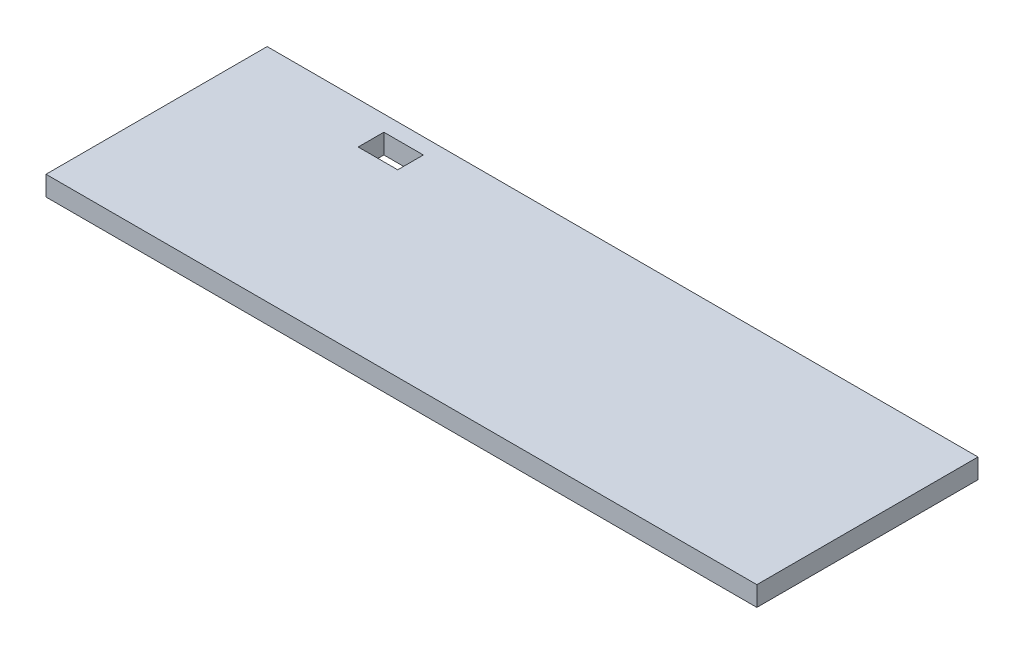
ISO-10303-21;
HEADER;
FILE_DESCRIPTION(('STEP AP214'),'2;1');
FILE_NAME('part.step','',(''),(''),'','','');
FILE_SCHEMA(('AUTOMOTIVE_DESIGN { 1 0 10303 214 1 1 1 1 }'));
ENDSEC;
DATA;
#1=APPLICATION_CONTEXT('core data for automotive mechanical design processes');
#2=APPLICATION_PROTOCOL_DEFINITION('international standard','automotive_design',2000,#1);
#3=PRODUCT_CONTEXT('',#1,'mechanical');
#4=PRODUCT('Part','Part','',(#3));
#5=PRODUCT_RELATED_PRODUCT_CATEGORY('part','',(#4));
#6=PRODUCT_DEFINITION_FORMATION('','',#4);
#7=PRODUCT_DEFINITION_CONTEXT('part definition',#1,'design');
#8=PRODUCT_DEFINITION('design','',#6,#7);
#9=PRODUCT_DEFINITION_SHAPE('','',#8);
#10=(LENGTH_UNIT() NAMED_UNIT(*) SI_UNIT(.MILLI.,.METRE.));
#11=(NAMED_UNIT(*) PLANE_ANGLE_UNIT() SI_UNIT($,.RADIAN.));
#12=(NAMED_UNIT(*) SI_UNIT($,.STERADIAN.) SOLID_ANGLE_UNIT());
#13=UNCERTAINTY_MEASURE_WITH_UNIT(LENGTH_MEASURE(1.E-05),#10,'distance_accuracy_value','');
#14=(GEOMETRIC_REPRESENTATION_CONTEXT(3) GLOBAL_UNCERTAINTY_ASSIGNED_CONTEXT((#13)) GLOBAL_UNIT_ASSIGNED_CONTEXT((#10,
#11,#12)) REPRESENTATION_CONTEXT('',''));
#15=CARTESIAN_POINT('',(0.,0.,0.));
#16=DIRECTION('',(0.,0.,1.));
#17=DIRECTION('',(1.,0.,0.));
#18=AXIS2_PLACEMENT_3D('',#15,#16,#17);
#19=CARTESIAN_POINT('',(0.,5.,0.));
#20=DIRECTION('',(0.,-1.,0.));
#21=DIRECTION('',(0.,0.,-1.));
#22=AXIS2_PLACEMENT_3D('',#19,#20,#21);
#23=PLANE('',#22);
#24=DIRECTION('',(0.,0.,-1.));
#25=VECTOR('',#24,1.);
#26=CARTESIAN_POINT('',(90.,5.,28.));
#27=LINE('',#26,#25);
#28=CARTESIAN_POINT('',(90.,5.,28.));
#29=VERTEX_POINT('',#28);
#30=CARTESIAN_POINT('',(90.,5.,-28.));
#31=VERTEX_POINT('',#30);
#32=EDGE_CURVE('E134',#29,#31,#27,.T.);
#33=ORIENTED_EDGE('',*,*,#32,.T.);
#34=DIRECTION('',(-1.,0.,0.));
#35=VECTOR('',#34,1.);
#36=CARTESIAN_POINT('',(-90.,5.,-28.));
#37=LINE('',#36,#35);
#38=CARTESIAN_POINT('',(-90.,5.,-28.));
#39=VERTEX_POINT('',#38);
#40=EDGE_CURVE('E137',#31,#39,#37,.T.);
#41=ORIENTED_EDGE('',*,*,#40,.T.);
#42=DIRECTION('',(0.,0.,1.));
#43=VECTOR('',#42,1.);
#44=CARTESIAN_POINT('',(-90.,5.,28.));
#45=LINE('',#44,#43);
#46=CARTESIAN_POINT('',(-90.,5.,28.));
#47=VERTEX_POINT('',#46);
#48=EDGE_CURVE('E140',#39,#47,#45,.T.);
#49=ORIENTED_EDGE('',*,*,#48,.T.);
#50=DIRECTION('',(1.,0.,0.));
#51=VECTOR('',#50,1.);
#52=CARTESIAN_POINT('',(-90.,5.,28.));
#53=LINE('',#52,#51);
#54=EDGE_CURVE('E142',#47,#29,#53,.T.);
#55=ORIENTED_EDGE('',*,*,#54,.T.);
#56=EDGE_LOOP('',(#33,#41,#49,#55));
#57=FACE_BOUND('',#56,.T.);
#58=DIRECTION('',(0.,0.,-1.));
#59=VECTOR('',#58,1.);
#60=CARTESIAN_POINT('',(-46.4434336198386,5.,-24.));
#61=LINE('',#60,#59);
#62=CARTESIAN_POINT('',(-46.4434336198386,5.,-17.5));
#63=VERTEX_POINT('',#62);
#64=CARTESIAN_POINT('',(-46.4434336198386,5.,-24.));
#65=VERTEX_POINT('',#64);
#66=EDGE_CURVE('E98',#63,#65,#61,.T.);
#67=ORIENTED_EDGE('',*,*,#66,.F.);
#68=DIRECTION('',(1.,0.,0.));
#69=VECTOR('',#68,1.);
#70=CARTESIAN_POINT('',(-56.4434336198386,5.,-17.5));
#71=LINE('',#70,#69);
#72=CARTESIAN_POINT('',(-56.4434336198386,5.,-17.5));
#73=VERTEX_POINT('',#72);
#74=EDGE_CURVE('E120',#73,#63,#71,.T.);
#75=ORIENTED_EDGE('',*,*,#74,.F.);
#76=DIRECTION('',(0.,0.,1.));
#77=VECTOR('',#76,1.);
#78=CARTESIAN_POINT('',(-56.4434336198386,5.,-24.));
#79=LINE('',#78,#77);
#80=CARTESIAN_POINT('',(-56.4434336198386,5.,-24.));
#81=VERTEX_POINT('',#80);
#82=EDGE_CURVE('E118',#81,#73,#79,.T.);
#83=ORIENTED_EDGE('',*,*,#82,.F.);
#84=DIRECTION('',(-1.,0.,0.));
#85=VECTOR('',#84,1.);
#86=CARTESIAN_POINT('',(-56.4434336198386,5.,-24.));
#87=LINE('',#86,#85);
#88=EDGE_CURVE('E106',#65,#81,#87,.T.);
#89=ORIENTED_EDGE('',*,*,#88,.F.);
#90=EDGE_LOOP('',(#67,#75,#83,#89));
#91=FACE_BOUND('',#90,.T.);
#92=ADVANCED_FACE('F33',(#57,#91),#23,.F.);
#93=CARTESIAN_POINT('',(0.,0.,0.));
#94=DIRECTION('',(0.,-1.,0.));
#95=DIRECTION('',(0.,0.,-1.));
#96=AXIS2_PLACEMENT_3D('',#93,#94,#95);
#97=PLANE('',#96);
#98=DIRECTION('',(0.,0.,-1.));
#99=VECTOR('',#98,1.);
#100=CARTESIAN_POINT('',(90.,0.,28.));
#101=LINE('',#100,#99);
#102=CARTESIAN_POINT('',(90.,0.,28.));
#103=VERTEX_POINT('',#102);
#104=CARTESIAN_POINT('',(90.,0.,-28.));
#105=VERTEX_POINT('',#104);
#106=EDGE_CURVE('E114',#103,#105,#101,.T.);
#107=ORIENTED_EDGE('',*,*,#106,.F.);
#108=DIRECTION('',(1.,0.,0.));
#109=VECTOR('',#108,1.);
#110=CARTESIAN_POINT('',(-90.,0.,28.));
#111=LINE('',#110,#109);
#112=CARTESIAN_POINT('',(-90.,0.,28.));
#113=VERTEX_POINT('',#112);
#114=EDGE_CURVE('E138',#113,#103,#111,.T.);
#115=ORIENTED_EDGE('',*,*,#114,.F.);
#116=DIRECTION('',(0.,0.,1.));
#117=VECTOR('',#116,1.);
#118=CARTESIAN_POINT('',(-90.,0.,28.));
#119=LINE('',#118,#117);
#120=CARTESIAN_POINT('',(-90.,0.,-28.));
#121=VERTEX_POINT('',#120);
#122=EDGE_CURVE('E149',#121,#113,#119,.T.);
#123=ORIENTED_EDGE('',*,*,#122,.F.);
#124=DIRECTION('',(-1.,0.,0.));
#125=VECTOR('',#124,1.);
#126=CARTESIAN_POINT('',(-90.,0.,-28.));
#127=LINE('',#126,#125);
#128=EDGE_CURVE('E147',#105,#121,#127,.T.);
#129=ORIENTED_EDGE('',*,*,#128,.F.);
#130=EDGE_LOOP('',(#107,#115,#123,#129));
#131=FACE_BOUND('',#130,.T.);
#132=DIRECTION('',(1.,0.,0.));
#133=VECTOR('',#132,1.);
#134=CARTESIAN_POINT('',(-56.4434336198386,0.,-17.5));
#135=LINE('',#134,#133);
#136=CARTESIAN_POINT('',(-56.4434336198386,0.,-17.5));
#137=VERTEX_POINT('',#136);
#138=CARTESIAN_POINT('',(-46.4434336198386,0.,-17.5));
#139=VERTEX_POINT('',#138);
#140=EDGE_CURVE('E107',#137,#139,#135,.T.);
#141=ORIENTED_EDGE('',*,*,#140,.T.);
#142=DIRECTION('',(0.,0.,-1.));
#143=VECTOR('',#142,1.);
#144=CARTESIAN_POINT('',(-46.4434336198386,0.,-24.));
#145=LINE('',#144,#143);
#146=CARTESIAN_POINT('',(-46.4434336198386,0.,-24.));
#147=VERTEX_POINT('',#146);
#148=EDGE_CURVE('E56',#139,#147,#145,.T.);
#149=ORIENTED_EDGE('',*,*,#148,.T.);
#150=DIRECTION('',(-1.,0.,0.));
#151=VECTOR('',#150,1.);
#152=CARTESIAN_POINT('',(-56.4434336198386,0.,-24.));
#153=LINE('',#152,#151);
#154=CARTESIAN_POINT('',(-56.4434336198386,0.,-24.));
#155=VERTEX_POINT('',#154);
#156=EDGE_CURVE('E113',#147,#155,#153,.T.);
#157=ORIENTED_EDGE('',*,*,#156,.T.);
#158=DIRECTION('',(0.,0.,1.));
#159=VECTOR('',#158,1.);
#160=CARTESIAN_POINT('',(-56.4434336198386,0.,-24.));
#161=LINE('',#160,#159);
#162=EDGE_CURVE('E126',#155,#137,#161,.T.);
#163=ORIENTED_EDGE('',*,*,#162,.T.);
#164=EDGE_LOOP('',(#141,#149,#157,#163));
#165=FACE_BOUND('',#164,.T.);
#166=ADVANCED_FACE('F167',(#131,#165),#97,.T.);
#167=CARTESIAN_POINT('',(90.,5.,28.));
#168=DIRECTION('',(-1.,0.,0.));
#169=DIRECTION('',(0.,0.,1.));
#170=AXIS2_PLACEMENT_3D('',#167,#168,#169);
#171=PLANE('',#170);
#172=ORIENTED_EDGE('',*,*,#106,.T.);
#173=DIRECTION('',(0.,-1.,0.));
#174=VECTOR('',#173,1.);
#175=CARTESIAN_POINT('',(90.,5.,-28.));
#176=LINE('',#175,#174);
#177=EDGE_CURVE('E11',#31,#105,#176,.T.);
#178=ORIENTED_EDGE('',*,*,#177,.F.);
#179=ORIENTED_EDGE('',*,*,#32,.F.);
#180=DIRECTION('',(0.,-1.,0.));
#181=VECTOR('',#180,1.);
#182=CARTESIAN_POINT('',(90.,5.,28.));
#183=LINE('',#182,#181);
#184=EDGE_CURVE('E144',#29,#103,#183,.T.);
#185=ORIENTED_EDGE('',*,*,#184,.T.);
#186=EDGE_LOOP('',(#172,#178,#179,#185));
#187=FACE_BOUND('',#186,.T.);
#188=ADVANCED_FACE('F35',(#187),#171,.F.);
#189=CARTESIAN_POINT('',(-90.,5.,-28.));
#190=DIRECTION('',(0.,0.,1.));
#191=DIRECTION('',(1.,0.,0.));
#192=AXIS2_PLACEMENT_3D('',#189,#190,#191);
#193=PLANE('',#192);
#194=ORIENTED_EDGE('',*,*,#128,.T.);
#195=DIRECTION('',(0.,-1.,0.));
#196=VECTOR('',#195,1.);
#197=CARTESIAN_POINT('',(-90.,5.,-28.));
#198=LINE('',#197,#196);
#199=EDGE_CURVE('E41',#39,#121,#198,.T.);
#200=ORIENTED_EDGE('',*,*,#199,.F.);
#201=ORIENTED_EDGE('',*,*,#40,.F.);
#202=ORIENTED_EDGE('',*,*,#177,.T.);
#203=EDGE_LOOP('',(#194,#200,#201,#202));
#204=FACE_BOUND('',#203,.T.);
#205=ADVANCED_FACE('F177',(#204),#193,.F.);
#206=CARTESIAN_POINT('',(-90.,5.,28.));
#207=DIRECTION('',(1.,0.,0.));
#208=DIRECTION('',(0.,0.,-1.));
#209=AXIS2_PLACEMENT_3D('',#206,#207,#208);
#210=PLANE('',#209);
#211=ORIENTED_EDGE('',*,*,#122,.T.);
#212=DIRECTION('',(0.,-1.,0.));
#213=VECTOR('',#212,1.);
#214=CARTESIAN_POINT('',(-90.,5.,28.));
#215=LINE('',#214,#213);
#216=EDGE_CURVE('E154',#47,#113,#215,.T.);
#217=ORIENTED_EDGE('',*,*,#216,.F.);
#218=ORIENTED_EDGE('',*,*,#48,.F.);
#219=ORIENTED_EDGE('',*,*,#199,.T.);
#220=EDGE_LOOP('',(#211,#217,#218,#219));
#221=FACE_BOUND('',#220,.T.);
#222=ADVANCED_FACE('F161',(#221),#210,.F.);
#223=CARTESIAN_POINT('',(-90.,5.,28.));
#224=DIRECTION('',(0.,0.,-1.));
#225=DIRECTION('',(-1.,0.,0.));
#226=AXIS2_PLACEMENT_3D('',#223,#224,#225);
#227=PLANE('',#226);
#228=ORIENTED_EDGE('',*,*,#114,.T.);
#229=ORIENTED_EDGE('',*,*,#184,.F.);
#230=ORIENTED_EDGE('',*,*,#54,.F.);
#231=ORIENTED_EDGE('',*,*,#216,.T.);
#232=EDGE_LOOP('',(#228,#229,#230,#231));
#233=FACE_BOUND('',#232,.T.);
#234=ADVANCED_FACE('F171',(#233),#227,.F.);
#235=CARTESIAN_POINT('',(-46.4434336198386,5.,-24.));
#236=DIRECTION('',(-1.,0.,0.));
#237=DIRECTION('',(0.,0.,1.));
#238=AXIS2_PLACEMENT_3D('',#235,#236,#237);
#239=PLANE('',#238);
#240=ORIENTED_EDGE('',*,*,#148,.F.);
#241=DIRECTION('',(0.,-1.,0.));
#242=VECTOR('',#241,1.);
#243=CARTESIAN_POINT('',(-46.4434336198386,5.,-17.5));
#244=LINE('',#243,#242);
#245=EDGE_CURVE('E102',#63,#139,#244,.T.);
#246=ORIENTED_EDGE('',*,*,#245,.F.);
#247=ORIENTED_EDGE('',*,*,#66,.T.);
#248=DIRECTION('',(0.,-1.,0.));
#249=VECTOR('',#248,1.);
#250=CARTESIAN_POINT('',(-46.4434336198386,5.,-24.));
#251=LINE('',#250,#249);
#252=EDGE_CURVE('E101',#65,#147,#251,.T.);
#253=ORIENTED_EDGE('',*,*,#252,.T.);
#254=EDGE_LOOP('',(#240,#246,#247,#253));
#255=FACE_BOUND('',#254,.T.);
#256=ADVANCED_FACE('F100',(#255),#239,.T.);
#257=CARTESIAN_POINT('',(-56.4434336198386,5.,-24.));
#258=DIRECTION('',(0.,0.,1.));
#259=DIRECTION('',(1.,0.,0.));
#260=AXIS2_PLACEMENT_3D('',#257,#258,#259);
#261=PLANE('',#260);
#262=ORIENTED_EDGE('',*,*,#156,.F.);
#263=ORIENTED_EDGE('',*,*,#252,.F.);
#264=ORIENTED_EDGE('',*,*,#88,.T.);
#265=DIRECTION('',(0.,-1.,0.));
#266=VECTOR('',#265,1.);
#267=CARTESIAN_POINT('',(-56.4434336198386,5.,-24.));
#268=LINE('',#267,#266);
#269=EDGE_CURVE('E115',#81,#155,#268,.T.);
#270=ORIENTED_EDGE('',*,*,#269,.T.);
#271=EDGE_LOOP('',(#262,#263,#264,#270));
#272=FACE_BOUND('',#271,.T.);
#273=ADVANCED_FACE('F110',(#272),#261,.T.);
#274=CARTESIAN_POINT('',(-56.4434336198386,5.,-24.));
#275=DIRECTION('',(1.,0.,0.));
#276=DIRECTION('',(0.,0.,-1.));
#277=AXIS2_PLACEMENT_3D('',#274,#275,#276);
#278=PLANE('',#277);
#279=ORIENTED_EDGE('',*,*,#162,.F.);
#280=ORIENTED_EDGE('',*,*,#269,.F.);
#281=ORIENTED_EDGE('',*,*,#82,.T.);
#282=DIRECTION('',(0.,-1.,0.));
#283=VECTOR('',#282,1.);
#284=CARTESIAN_POINT('',(-56.4434336198386,5.,-17.5));
#285=LINE('',#284,#283);
#286=EDGE_CURVE('E48',#73,#137,#285,.T.);
#287=ORIENTED_EDGE('',*,*,#286,.T.);
#288=EDGE_LOOP('',(#279,#280,#281,#287));
#289=FACE_BOUND('',#288,.T.);
#290=ADVANCED_FACE('F200',(#289),#278,.T.);
#291=CARTESIAN_POINT('',(-56.4434336198386,5.,-17.5));
#292=DIRECTION('',(0.,0.,-1.));
#293=DIRECTION('',(-1.,0.,0.));
#294=AXIS2_PLACEMENT_3D('',#291,#292,#293);
#295=PLANE('',#294);
#296=ORIENTED_EDGE('',*,*,#140,.F.);
#297=ORIENTED_EDGE('',*,*,#286,.F.);
#298=ORIENTED_EDGE('',*,*,#74,.T.);
#299=ORIENTED_EDGE('',*,*,#245,.T.);
#300=EDGE_LOOP('',(#296,#297,#298,#299));
#301=FACE_BOUND('',#300,.T.);
#302=ADVANCED_FACE('F204',(#301),#295,.T.);
#303=CLOSED_SHELL('',(#92,#166,#188,#205,#222,#234,#256,#273,#290,#302));
#304=MANIFOLD_SOLID_BREP('B2',#303);
#305=ADVANCED_BREP_SHAPE_REPRESENTATION('',(#18,#304),#14);
#306=SHAPE_DEFINITION_REPRESENTATION(#9,#305);
ENDSEC;
END-ISO-10303-21;
